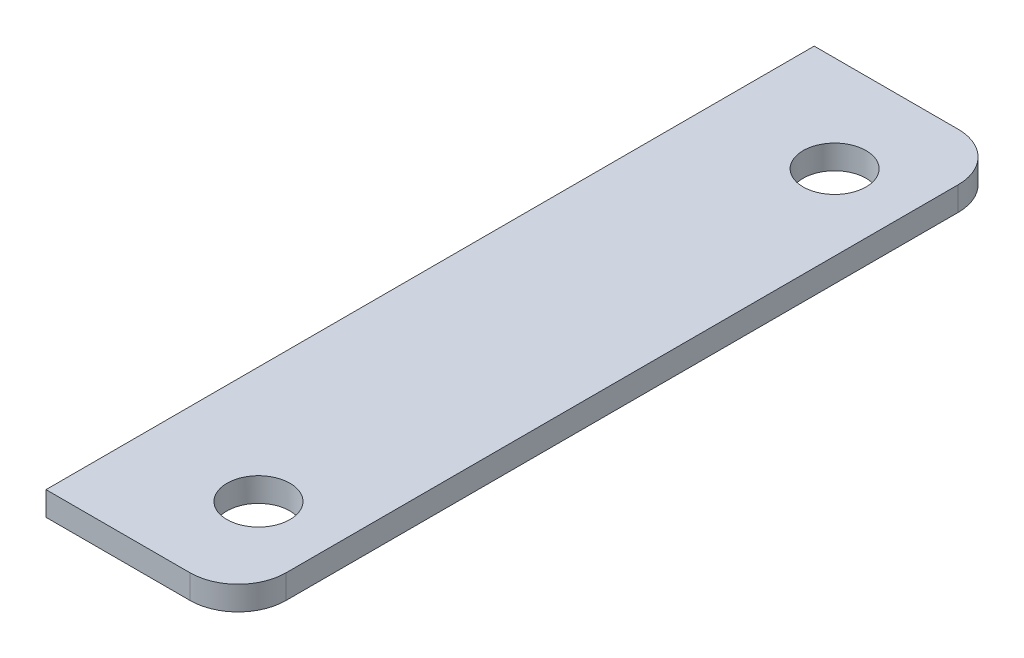
ISO-10303-21;
HEADER;
FILE_DESCRIPTION(('STEP AP214'),'2;1');
FILE_NAME('part.step','',(''),(''),'','','');
FILE_SCHEMA(('AUTOMOTIVE_DESIGN { 1 0 10303 214 1 1 1 1 }'));
ENDSEC;
DATA;
#1=APPLICATION_CONTEXT('core data for automotive mechanical design processes');
#2=APPLICATION_PROTOCOL_DEFINITION('international standard','automotive_design',2000,#1);
#3=PRODUCT_CONTEXT('',#1,'mechanical');
#4=PRODUCT('Part','Part','',(#3));
#5=PRODUCT_RELATED_PRODUCT_CATEGORY('part','',(#4));
#6=PRODUCT_DEFINITION_FORMATION('','',#4);
#7=PRODUCT_DEFINITION_CONTEXT('part definition',#1,'design');
#8=PRODUCT_DEFINITION('design','',#6,#7);
#9=PRODUCT_DEFINITION_SHAPE('','',#8);
#10=(LENGTH_UNIT() NAMED_UNIT(*) SI_UNIT(.MILLI.,.METRE.));
#11=(NAMED_UNIT(*) PLANE_ANGLE_UNIT() SI_UNIT($,.RADIAN.));
#12=(NAMED_UNIT(*) SI_UNIT($,.STERADIAN.) SOLID_ANGLE_UNIT());
#13=UNCERTAINTY_MEASURE_WITH_UNIT(LENGTH_MEASURE(1.E-05),#10,'distance_accuracy_value','');
#14=(GEOMETRIC_REPRESENTATION_CONTEXT(3) GLOBAL_UNCERTAINTY_ASSIGNED_CONTEXT((#13)) GLOBAL_UNIT_ASSIGNED_CONTEXT((#10,
#11,#12)) REPRESENTATION_CONTEXT('',''));
#15=CARTESIAN_POINT('',(0.,0.,0.));
#16=DIRECTION('',(0.,0.,1.));
#17=DIRECTION('',(1.,0.,0.));
#18=AXIS2_PLACEMENT_3D('',#15,#16,#17);
#19=CARTESIAN_POINT('',(12.7,3.175,-50.8));
#20=DIRECTION('',(-1.,0.,0.));
#21=DIRECTION('',(0.,0.,1.));
#22=AXIS2_PLACEMENT_3D('',#19,#20,#21);
#23=PLANE('',#22);
#24=DIRECTION('',(0.,0.,-1.));
#25=VECTOR('',#24,1.);
#26=CARTESIAN_POINT('',(12.7,0.,-50.8));
#27=LINE('',#26,#25);
#28=CARTESIAN_POINT('',(12.7,0.,44.45));
#29=VERTEX_POINT('',#28);
#30=CARTESIAN_POINT('',(12.7,0.,-44.45));
#31=VERTEX_POINT('',#30);
#32=EDGE_CURVE('E141',#29,#31,#27,.T.);
#33=ORIENTED_EDGE('',*,*,#32,.T.);
#34=DIRECTION('',(0.,-1.,0.));
#35=VECTOR('',#34,1.);
#36=CARTESIAN_POINT('',(12.7,3.175,-44.45));
#37=LINE('',#36,#35);
#38=CARTESIAN_POINT('',(12.7,3.175,-44.45));
#39=VERTEX_POINT('',#38);
#40=EDGE_CURVE('E66',#31,#39,#37,.F.);
#41=ORIENTED_EDGE('',*,*,#40,.T.);
#42=DIRECTION('',(0.,0.,-1.));
#43=VECTOR('',#42,1.);
#44=CARTESIAN_POINT('',(12.7,3.175,-50.8));
#45=LINE('',#44,#43);
#46=CARTESIAN_POINT('',(12.7,3.175,44.45));
#47=VERTEX_POINT('',#46);
#48=EDGE_CURVE('E117',#47,#39,#45,.T.);
#49=ORIENTED_EDGE('',*,*,#48,.F.);
#50=DIRECTION('',(0.,-1.,0.));
#51=VECTOR('',#50,1.);
#52=CARTESIAN_POINT('',(12.7,3.175,44.45));
#53=LINE('',#52,#51);
#54=EDGE_CURVE('E161',#47,#29,#53,.T.);
#55=ORIENTED_EDGE('',*,*,#54,.T.);
#56=EDGE_LOOP('',(#33,#41,#49,#55));
#57=FACE_BOUND('',#56,.T.);
#58=ADVANCED_FACE('F39',(#57),#23,.F.);
#59=CARTESIAN_POINT('',(-12.7,3.175,-50.8));
#60=DIRECTION('',(0.,0.,1.));
#61=DIRECTION('',(1.,0.,0.));
#62=AXIS2_PLACEMENT_3D('',#59,#60,#61);
#63=PLANE('',#62);
#64=DIRECTION('',(-1.,0.,0.));
#65=VECTOR('',#64,1.);
#66=CARTESIAN_POINT('',(-12.7,3.175,-50.8));
#67=LINE('',#66,#65);
#68=CARTESIAN_POINT('',(6.34999999999999,3.175,-50.8));
#69=VERTEX_POINT('',#68);
#70=CARTESIAN_POINT('',(-12.7,3.175,-50.8));
#71=VERTEX_POINT('',#70);
#72=EDGE_CURVE('E106',#69,#71,#67,.T.);
#73=ORIENTED_EDGE('',*,*,#72,.F.);
#74=DIRECTION('',(0.,-1.,0.));
#75=VECTOR('',#74,1.);
#76=CARTESIAN_POINT('',(6.34999999999999,3.175,-50.8));
#77=LINE('',#76,#75);
#78=CARTESIAN_POINT('',(6.34999999999999,0.,-50.8));
#79=VERTEX_POINT('',#78);
#80=EDGE_CURVE('E127',#69,#79,#77,.T.);
#81=ORIENTED_EDGE('',*,*,#80,.T.);
#82=DIRECTION('',(-1.,0.,0.));
#83=VECTOR('',#82,1.);
#84=CARTESIAN_POINT('',(-12.7,0.,-50.8));
#85=LINE('',#84,#83);
#86=CARTESIAN_POINT('',(-12.7,0.,-50.8));
#87=VERTEX_POINT('',#86);
#88=EDGE_CURVE('E123',#79,#87,#85,.T.);
#89=ORIENTED_EDGE('',*,*,#88,.T.);
#90=DIRECTION('',(0.,-1.,0.));
#91=VECTOR('',#90,1.);
#92=CARTESIAN_POINT('',(-12.7,3.175,-50.8));
#93=LINE('',#92,#91);
#94=EDGE_CURVE('E120',#71,#87,#93,.T.);
#95=ORIENTED_EDGE('',*,*,#94,.F.);
#96=EDGE_LOOP('',(#73,#81,#89,#95));
#97=FACE_BOUND('',#96,.T.);
#98=ADVANCED_FACE('F121',(#97),#63,.F.);
#99=CARTESIAN_POINT('',(-12.7,3.175,-50.8));
#100=DIRECTION('',(1.,0.,0.));
#101=DIRECTION('',(0.,0.,-1.));
#102=AXIS2_PLACEMENT_3D('',#99,#100,#101);
#103=PLANE('',#102);
#104=DIRECTION('',(0.,0.,1.));
#105=VECTOR('',#104,1.);
#106=CARTESIAN_POINT('',(-12.7,0.,-50.8));
#107=LINE('',#106,#105);
#108=CARTESIAN_POINT('',(-12.7,0.,50.8));
#109=VERTEX_POINT('',#108);
#110=EDGE_CURVE('E146',#87,#109,#107,.T.);
#111=ORIENTED_EDGE('',*,*,#110,.T.);
#112=DIRECTION('',(0.,-1.,0.));
#113=VECTOR('',#112,1.);
#114=CARTESIAN_POINT('',(-12.7,3.175,50.8));
#115=LINE('',#114,#113);
#116=CARTESIAN_POINT('',(-12.7,3.175,50.8));
#117=VERTEX_POINT('',#116);
#118=EDGE_CURVE('E128',#117,#109,#115,.T.);
#119=ORIENTED_EDGE('',*,*,#118,.F.);
#120=DIRECTION('',(0.,0.,1.));
#121=VECTOR('',#120,1.);
#122=CARTESIAN_POINT('',(-12.7,3.175,-50.8));
#123=LINE('',#122,#121);
#124=EDGE_CURVE('E110',#71,#117,#123,.T.);
#125=ORIENTED_EDGE('',*,*,#124,.F.);
#126=ORIENTED_EDGE('',*,*,#94,.T.);
#127=EDGE_LOOP('',(#111,#119,#125,#126));
#128=FACE_BOUND('',#127,.T.);
#129=ADVANCED_FACE('F130',(#128),#103,.F.);
#130=CARTESIAN_POINT('',(-12.7,3.175,50.8));
#131=DIRECTION('',(0.,0.,-1.));
#132=DIRECTION('',(-1.,0.,0.));
#133=AXIS2_PLACEMENT_3D('',#130,#131,#132);
#134=PLANE('',#133);
#135=DIRECTION('',(1.,0.,0.));
#136=VECTOR('',#135,1.);
#137=CARTESIAN_POINT('',(-12.7,0.,50.8));
#138=LINE('',#137,#136);
#139=CARTESIAN_POINT('',(6.35,0.,50.8));
#140=VERTEX_POINT('',#139);
#141=EDGE_CURVE('E148',#109,#140,#138,.T.);
#142=ORIENTED_EDGE('',*,*,#141,.T.);
#143=DIRECTION('',(0.,-1.,0.));
#144=VECTOR('',#143,1.);
#145=CARTESIAN_POINT('',(6.35,3.175,50.8));
#146=LINE('',#145,#144);
#147=CARTESIAN_POINT('',(6.35,3.175,50.8));
#148=VERTEX_POINT('',#147);
#149=EDGE_CURVE('E11',#140,#148,#146,.F.);
#150=ORIENTED_EDGE('',*,*,#149,.T.);
#151=DIRECTION('',(1.,0.,0.));
#152=VECTOR('',#151,1.);
#153=CARTESIAN_POINT('',(-12.7,3.175,50.8));
#154=LINE('',#153,#152);
#155=EDGE_CURVE('E133',#117,#148,#154,.T.);
#156=ORIENTED_EDGE('',*,*,#155,.F.);
#157=ORIENTED_EDGE('',*,*,#118,.T.);
#158=EDGE_LOOP('',(#142,#150,#156,#157));
#159=FACE_BOUND('',#158,.T.);
#160=ADVANCED_FACE('F196',(#159),#134,.F.);
#161=CARTESIAN_POINT('',(0.,3.175,0.));
#162=DIRECTION('',(0.,1.,0.));
#163=DIRECTION('',(0.,0.,1.));
#164=AXIS2_PLACEMENT_3D('',#161,#162,#163);
#165=PLANE('',#164);
#166=CARTESIAN_POINT('',(2.69999999999998,3.175,-38.1));
#167=DIRECTION('',(0.,1.,0.));
#168=DIRECTION('',(0.,0.,1.));
#169=AXIS2_PLACEMENT_3D('',#166,#167,#168);
#170=CIRCLE('',#169,4.165);
#171=CARTESIAN_POINT('',(2.69999999999998,3.175,-33.935));
#172=VERTEX_POINT('',#171);
#173=EDGE_CURVE('E171',#172,#172,#170,.T.);
#174=ORIENTED_EDGE('',*,*,#173,.F.);
#175=EDGE_LOOP('',(#174));
#176=FACE_BOUND('',#175,.T.);
#177=CARTESIAN_POINT('',(2.69999999999998,3.175,38.1));
#178=DIRECTION('',(0.,1.,0.));
#179=DIRECTION('',(0.,0.,-1.));
#180=AXIS2_PLACEMENT_3D('',#177,#178,#179);
#181=CIRCLE('',#180,4.165);
#182=CARTESIAN_POINT('',(2.69999999999998,3.175,33.935));
#183=VERTEX_POINT('',#182);
#184=EDGE_CURVE('E179',#183,#183,#181,.T.);
#185=ORIENTED_EDGE('',*,*,#184,.F.);
#186=EDGE_LOOP('',(#185));
#187=FACE_BOUND('',#186,.T.);
#188=ORIENTED_EDGE('',*,*,#48,.T.);
#189=CARTESIAN_POINT('',(6.34999999999999,3.175,-44.45));
#190=DIRECTION('',(0.,1.,0.));
#191=DIRECTION('',(0.,0.,1.));
#192=AXIS2_PLACEMENT_3D('',#189,#190,#191);
#193=CIRCLE('',#192,6.35);
#194=EDGE_CURVE('E48',#39,#69,#193,.T.);
#195=ORIENTED_EDGE('',*,*,#194,.T.);
#196=ORIENTED_EDGE('',*,*,#72,.T.);
#197=ORIENTED_EDGE('',*,*,#124,.T.);
#198=ORIENTED_EDGE('',*,*,#155,.T.);
#199=CARTESIAN_POINT('',(6.35,3.175,44.45));
#200=DIRECTION('',(0.,1.,0.));
#201=DIRECTION('',(0.,0.,1.));
#202=AXIS2_PLACEMENT_3D('',#199,#200,#201);
#203=CIRCLE('',#202,6.35);
#204=EDGE_CURVE('E167',#148,#47,#203,.T.);
#205=ORIENTED_EDGE('',*,*,#204,.T.);
#206=EDGE_LOOP('',(#188,#195,#196,#197,#198,#205));
#207=FACE_BOUND('',#206,.T.);
#208=ADVANCED_FACE('F108',(#176,#187,#207),#165,.T.);
#209=CARTESIAN_POINT('',(0.,0.,0.));
#210=DIRECTION('',(0.,1.,0.));
#211=DIRECTION('',(0.,0.,1.));
#212=AXIS2_PLACEMENT_3D('',#209,#210,#211);
#213=PLANE('',#212);
#214=CARTESIAN_POINT('',(2.69999999999998,0.,-38.1));
#215=DIRECTION('',(0.,1.,0.));
#216=DIRECTION('',(0.,0.,1.));
#217=AXIS2_PLACEMENT_3D('',#214,#215,#216);
#218=CIRCLE('',#217,4.165);
#219=CARTESIAN_POINT('',(2.69999999999998,0.,-33.935));
#220=VERTEX_POINT('',#219);
#221=EDGE_CURVE('E143',#220,#220,#218,.F.);
#222=ORIENTED_EDGE('',*,*,#221,.F.);
#223=EDGE_LOOP('',(#222));
#224=FACE_BOUND('',#223,.T.);
#225=CARTESIAN_POINT('',(2.69999999999998,0.,38.1));
#226=DIRECTION('',(0.,1.,0.));
#227=DIRECTION('',(0.,0.,1.));
#228=AXIS2_PLACEMENT_3D('',#225,#226,#227);
#229=CIRCLE('',#228,4.165);
#230=CARTESIAN_POINT('',(2.69999999999998,0.,42.265));
#231=VERTEX_POINT('',#230);
#232=EDGE_CURVE('E174',#231,#231,#229,.F.);
#233=ORIENTED_EDGE('',*,*,#232,.F.);
#234=EDGE_LOOP('',(#233));
#235=FACE_BOUND('',#234,.T.);
#236=ORIENTED_EDGE('',*,*,#88,.F.);
#237=CARTESIAN_POINT('',(6.34999999999999,0.,-44.45));
#238=DIRECTION('',(0.,1.,0.));
#239=DIRECTION('',(0.,0.,1.));
#240=AXIS2_PLACEMENT_3D('',#237,#238,#239);
#241=CIRCLE('',#240,6.35);
#242=EDGE_CURVE('E158',#79,#31,#241,.F.);
#243=ORIENTED_EDGE('',*,*,#242,.T.);
#244=ORIENTED_EDGE('',*,*,#32,.F.);
#245=CARTESIAN_POINT('',(6.35,0.,44.45));
#246=DIRECTION('',(0.,1.,0.));
#247=DIRECTION('',(0.,0.,1.));
#248=AXIS2_PLACEMENT_3D('',#245,#246,#247);
#249=CIRCLE('',#248,6.35);
#250=EDGE_CURVE('E155',#29,#140,#249,.F.);
#251=ORIENTED_EDGE('',*,*,#250,.T.);
#252=ORIENTED_EDGE('',*,*,#141,.F.);
#253=ORIENTED_EDGE('',*,*,#110,.F.);
#254=EDGE_LOOP('',(#236,#243,#244,#251,#252,#253));
#255=FACE_BOUND('',#254,.T.);
#256=ADVANCED_FACE('F193',(#224,#235,#255),#213,.F.);
#257=CARTESIAN_POINT('',(6.34999999999999,3.175,-44.45));
#258=DIRECTION('',(0.,-1.,0.));
#259=DIRECTION('',(0.,0.,-1.));
#260=AXIS2_PLACEMENT_3D('',#257,#258,#259);
#261=CYLINDRICAL_SURFACE('',#260,6.35);
#262=ORIENTED_EDGE('',*,*,#194,.F.);
#263=ORIENTED_EDGE('',*,*,#40,.F.);
#264=ORIENTED_EDGE('',*,*,#242,.F.);
#265=ORIENTED_EDGE('',*,*,#80,.F.);
#266=EDGE_LOOP('',(#262,#263,#264,#265));
#267=FACE_BOUND('',#266,.T.);
#268=ADVANCED_FACE('F191',(#267),#261,.T.);
#269=CARTESIAN_POINT('',(6.35,3.175,44.45));
#270=DIRECTION('',(0.,-1.,0.));
#271=DIRECTION('',(0.,0.,-1.));
#272=AXIS2_PLACEMENT_3D('',#269,#270,#271);
#273=CYLINDRICAL_SURFACE('',#272,6.35);
#274=ORIENTED_EDGE('',*,*,#204,.F.);
#275=ORIENTED_EDGE('',*,*,#149,.F.);
#276=ORIENTED_EDGE('',*,*,#250,.F.);
#277=ORIENTED_EDGE('',*,*,#54,.F.);
#278=EDGE_LOOP('',(#274,#275,#276,#277));
#279=FACE_BOUND('',#278,.T.);
#280=ADVANCED_FACE('F41',(#279),#273,.T.);
#281=CARTESIAN_POINT('',(2.69999999999998,-0.00100000000000013,38.1));
#282=DIRECTION('',(0.,1.,0.));
#283=DIRECTION('',(0.,0.,1.));
#284=AXIS2_PLACEMENT_3D('',#281,#282,#283);
#285=CYLINDRICAL_SURFACE('',#284,4.165);
#286=ORIENTED_EDGE('',*,*,#184,.T.);
#287=EDGE_LOOP('',(#286));
#288=FACE_BOUND('',#287,.T.);
#289=ORIENTED_EDGE('',*,*,#232,.T.);
#290=EDGE_LOOP('',(#289));
#291=FACE_BOUND('',#290,.T.);
#292=ADVANCED_FACE('F210',(#288,#291),#285,.F.);
#293=CARTESIAN_POINT('',(2.69999999999998,-0.00100000000000013,-38.1));
#294=DIRECTION('',(0.,1.,0.));
#295=DIRECTION('',(0.,0.,1.));
#296=AXIS2_PLACEMENT_3D('',#293,#294,#295);
#297=CYLINDRICAL_SURFACE('',#296,4.165);
#298=ORIENTED_EDGE('',*,*,#173,.T.);
#299=EDGE_LOOP('',(#298));
#300=FACE_BOUND('',#299,.T.);
#301=ORIENTED_EDGE('',*,*,#221,.T.);
#302=EDGE_LOOP('',(#301));
#303=FACE_BOUND('',#302,.T.);
#304=ADVANCED_FACE('F231',(#300,#303),#297,.F.);
#305=CLOSED_SHELL('',(#58,#98,#129,#160,#208,#256,#268,#280,#292,#304));
#306=MANIFOLD_SOLID_BREP('B2',#305);
#307=ADVANCED_BREP_SHAPE_REPRESENTATION('',(#18,#306),#14);
#308=SHAPE_DEFINITION_REPRESENTATION(#9,#307);
ENDSEC;
END-ISO-10303-21;
